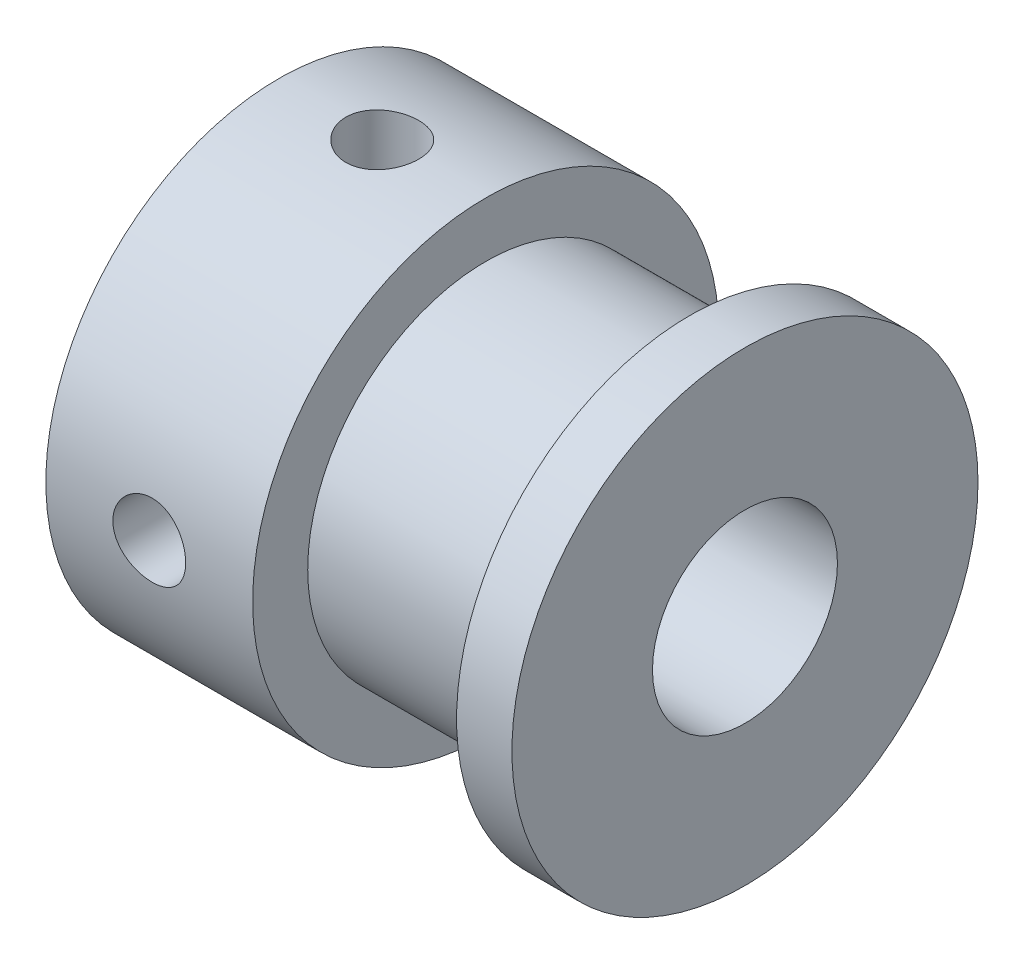
ISO-10303-21;
HEADER;
FILE_DESCRIPTION(('STEP AP214'),'2;1');
FILE_NAME('part.step','',(''),(''),'','','');
FILE_SCHEMA(('AUTOMOTIVE_DESIGN { 1 0 10303 214 1 1 1 1 }'));
ENDSEC;
DATA;
#1=APPLICATION_CONTEXT('core data for automotive mechanical design processes');
#2=APPLICATION_PROTOCOL_DEFINITION('international standard','automotive_design',2000,#1);
#3=PRODUCT_CONTEXT('',#1,'mechanical');
#4=PRODUCT('Part','Part','',(#3));
#5=PRODUCT_RELATED_PRODUCT_CATEGORY('part','',(#4));
#6=PRODUCT_DEFINITION_FORMATION('','',#4);
#7=PRODUCT_DEFINITION_CONTEXT('part definition',#1,'design');
#8=PRODUCT_DEFINITION('design','',#6,#7);
#9=PRODUCT_DEFINITION_SHAPE('','',#8);
#10=(LENGTH_UNIT() NAMED_UNIT(*) SI_UNIT(.MILLI.,.METRE.));
#11=(NAMED_UNIT(*) PLANE_ANGLE_UNIT() SI_UNIT($,.RADIAN.));
#12=(NAMED_UNIT(*) SI_UNIT($,.STERADIAN.) SOLID_ANGLE_UNIT());
#13=UNCERTAINTY_MEASURE_WITH_UNIT(LENGTH_MEASURE(1.E-05),#10,'distance_accuracy_value','');
#14=(GEOMETRIC_REPRESENTATION_CONTEXT(3) GLOBAL_UNCERTAINTY_ASSIGNED_CONTEXT((#13)) GLOBAL_UNIT_ASSIGNED_CONTEXT((#10,
#11,#12)) REPRESENTATION_CONTEXT('',''));
#15=CARTESIAN_POINT('',(0.,0.,0.));
#16=DIRECTION('',(0.,0.,1.));
#17=DIRECTION('',(1.,0.,0.));
#18=AXIS2_PLACEMENT_3D('',#15,#16,#17);
#19=CARTESIAN_POINT('',(0.,0.,0.));
#20=DIRECTION('',(1.,0.,0.));
#21=DIRECTION('',(0.,0.,-1.));
#22=AXIS2_PLACEMENT_3D('',#19,#20,#21);
#23=CYLINDRICAL_SURFACE('',#22,3.175);
#24=CARTESIAN_POINT('',(2.30000000000001,0.,3.175));
#25=CARTESIAN_POINT('',(2.3000068627745,0.0672847316330923,3.17499501338285));
#26=CARTESIAN_POINT('',(2.30546359305505,0.1346703640608,3.17283650663751));
#27=CARTESIAN_POINT('',(2.32710352845715,0.267542369031608,3.16441250521978));
#28=CARTESIAN_POINT('',(2.34331412522152,0.333023444641002,3.15813652319774));
#29=CARTESIAN_POINT('',(2.3857829777871,0.459957962416116,3.14215557601542));
#30=CARTESIAN_POINT('',(2.41200951215206,0.521423409993961,3.1324614438269));
#31=CARTESIAN_POINT('',(2.47364090841074,0.63903164640658,3.11060223187218));
#32=CARTESIAN_POINT('',(2.5090429677438,0.695176053354679,3.09843790684371));
#33=CARTESIAN_POINT('',(2.5897376821198,0.803199302091193,3.07224897424454));
#34=CARTESIAN_POINT('',(2.63538195508738,0.854801684849635,3.05816785515032));
#35=CARTESIAN_POINT('',(2.73452307874792,0.949851027050097,3.029995134943));
#36=CARTESIAN_POINT('',(2.78802352829044,0.993294227940917,3.01590353198658));
#37=CARTESIAN_POINT('',(2.9041424024409,1.07262244667806,2.98863572549245));
#38=CARTESIAN_POINT('',(2.96705314443539,1.10810421355732,2.97552454842956));
#39=CARTESIAN_POINT('',(3.098544027874,1.16785949338492,2.95258553832485));
#40=CARTESIAN_POINT('',(3.1671215628923,1.19213812572271,2.94275620617845));
#41=CARTESIAN_POINT('',(3.30482457540723,1.22768807019404,2.92809906106053));
#42=CARTESIAN_POINT('',(3.37379138336201,1.2394876533875,2.92306908743274));
#43=CARTESIAN_POINT('',(3.51289538673181,1.25139521634013,2.91799267608066));
#44=CARTESIAN_POINT('',(3.58303201481214,1.2515087076257,2.91794388907308));
#45=CARTESIAN_POINT('',(3.71747264612622,1.24044215294952,2.92266241514435));
#46=CARTESIAN_POINT('',(3.78185243388379,1.2300187638983,2.9271070555664));
#47=CARTESIAN_POINT('',(3.90786207063953,1.19943319152663,2.93977143360488));
#48=CARTESIAN_POINT('',(3.96949145415953,1.17926936651212,2.94799180758784));
#49=CARTESIAN_POINT('',(4.08970949878321,1.12939589279822,2.9674595549287));
#50=CARTESIAN_POINT('',(4.14821240698524,1.09950293840843,2.97876432051874));
#51=CARTESIAN_POINT('',(4.25958183190654,1.03114819003906,3.00311044973729));
#52=CARTESIAN_POINT('',(4.31244626347388,0.992683242204218,3.01615245182717));
#53=CARTESIAN_POINT('',(4.41519223792226,0.90489847311778,3.04369028436772));
#54=CARTESIAN_POINT('',(4.46455620057866,0.854982538626526,3.05822195069566));
#55=CARTESIAN_POINT('',(4.55437521291327,0.747422600693477,3.08627133748347));
#56=CARTESIAN_POINT('',(4.59482859712145,0.68977715576794,3.09978886808114));
#57=CARTESIAN_POINT('',(4.66632885010501,0.566964697663757,3.12460676760529));
#58=CARTESIAN_POINT('',(4.69718676961865,0.501677729871156,3.13586122258918));
#59=CARTESIAN_POINT('',(4.74730502697112,0.366284378650628,3.15453954285868));
#60=CARTESIAN_POINT('',(4.76657106552982,0.296180383098903,3.16196529078971));
#61=CARTESIAN_POINT('',(4.79192526522841,0.15748598181363,3.17180954080983));
#62=CARTESIAN_POINT('',(4.798709348115,0.0890414587092499,3.174492125026));
#63=CARTESIAN_POINT('',(4.8009546291958,-0.0480536320474739,3.17537559014029));
#64=CARTESIAN_POINT('',(4.79641864995898,-0.116704144074904,3.17357758823769));
#65=CARTESIAN_POINT('',(4.7766688987383,-0.249146112043378,3.1658751934269));
#66=CARTESIAN_POINT('',(4.76192521803439,-0.313019327348947,3.16015168509209));
#67=CARTESIAN_POINT('',(4.72281288402532,-0.437330047990826,3.14535985768854));
#68=CARTESIAN_POINT('',(4.69844298886303,-0.497767108885045,3.1362911070673));
#69=CARTESIAN_POINT('',(4.63997777394203,-0.615550644692232,3.11535083253378));
#70=CARTESIAN_POINT('',(4.60560984846939,-0.672747743207499,3.10340262881889));
#71=CARTESIAN_POINT('',(4.52842792642724,-0.780761917259374,3.07800576012949));
#72=CARTESIAN_POINT('',(4.48561060602606,-0.831576469108153,3.06455650557748));
#73=CARTESIAN_POINT('',(4.38952965745297,-0.928791348114859,3.0365593899859));
#74=CARTESIAN_POINT('',(4.33577293586608,-0.974701227513619,3.02199629492691));
#75=CARTESIAN_POINT('',(4.22105274982168,-1.05696284943212,2.99421855171024));
#76=CARTESIAN_POINT('',(4.16008825217309,-1.09331321924023,2.98100409737911));
#77=CARTESIAN_POINT('',(4.03187774635261,-1.15559997165607,2.95742074651155));
#78=CARTESIAN_POINT('',(3.96458459593159,-1.18144907129597,2.9470759174758));
#79=CARTESIAN_POINT('',(3.8260725952737,-1.2212562072246,2.93080697789355));
#80=CARTESIAN_POINT('',(3.75485655568267,-1.23522264211379,2.92487974538276));
#81=CARTESIAN_POINT('',(3.61589405502895,-1.25007804085777,2.91855940228496));
#82=CARTESIAN_POINT('',(3.5482538653394,-1.25181430561831,2.91780781401761));
#83=CARTESIAN_POINT('',(3.41369577979596,-1.24437120429059,2.92098982763324));
#84=CARTESIAN_POINT('',(3.34677779981834,-1.23519312367105,2.92492287776943));
#85=CARTESIAN_POINT('',(3.21810207173594,-1.20686591196944,2.93671925445626));
#86=CARTESIAN_POINT('',(3.15624498467543,-1.18809939057282,2.9444313340829));
#87=CARTESIAN_POINT('',(3.03652982106708,-1.14148049607648,2.96281485611587));
#88=CARTESIAN_POINT('',(2.97867280512971,-1.1136257243581,2.97348707966731));
#89=CARTESIAN_POINT('',(2.8650674647447,-1.04781462002773,2.99733186522452));
#90=CARTESIAN_POINT('',(2.80961923756217,-1.00937948877753,3.01061106475901));
#91=CARTESIAN_POINT('',(2.70568987821778,-0.924206507043677,3.0378387527675));
#92=CARTESIAN_POINT('',(2.65721118976831,-0.877465757163236,3.05178747371865));
#93=CARTESIAN_POINT('',(2.56551587816836,-0.773553196077987,3.07982295515274));
#94=CARTESIAN_POINT('',(2.52281309958007,-0.715913819660186,3.09386447942524));
#95=CARTESIAN_POINT('',(2.44769454049986,-0.593766403796401,3.11960779538581));
#96=CARTESIAN_POINT('',(2.41528012935281,-0.529257451559142,3.13130927554577));
#97=CARTESIAN_POINT('',(2.36417540099936,-0.400855491445671,3.15020502613284));
#98=CARTESIAN_POINT('',(2.34455266817755,-0.337376283301317,3.15769788512325));
#99=CARTESIAN_POINT('',(2.31563614784328,-0.207895662632507,3.16884766902594));
#100=CARTESIAN_POINT('',(2.30631397142025,-0.141901703524203,3.17251513536217));
#101=CARTESIAN_POINT('',(2.30076135384054,-0.0504531001608372,3.17470085654944));
#102=CARTESIAN_POINT('',(2.2999974262687,-0.0252336457199433,3.17500187012012));
#103=CARTESIAN_POINT('',(2.30000000000001,0.,3.175));
#104=B_SPLINE_CURVE_WITH_KNOTS('',3,(#24,#25,#26,#27,#28,#29,#30,#31,#32,#33,#34,#35,#36,#37,
#38,#39,#40,#41,#42,#43,#44,#45,#46,#47,#48,#49,#50,#51,#52,#53,#54,#55,#56,#57,#58,#59,#60,#61,
#62,#63,#64,#65,#66,#67,#68,#69,#70,#71,#72,#73,#74,#75,#76,#77,#78,#79,#80,#81,#82,#83,#84,#85,
#86,#87,#88,#89,#90,#91,#92,#93,#94,#95,#96,#97,#98,#99,#100,#101,#102,#103),.UNSPECIFIED.,.T.,
.F.,(4,2,2,2,2,2,2,2,2,2,2,2,2,2,2,2,2,2,2,2,2,2,2,2,2,2,2,2,2,2,2,2,2,2,2,2,2,2,2,4),(0.,
0.201779437744548,0.404074820308127,0.605734757050763,0.807333171478417,1.01735976436243,
1.2274828705813,1.44660259463333,1.66562209023744,1.87494520835713,2.08416960269575,
2.27936669865592,2.47459670544107,2.67374147234743,2.87295963102294,3.08705517744558,
3.30119070642572,3.51930901537433,3.73731996902137,3.94275765182502,4.14814411546712,
4.34465147529728,4.54118419440118,4.7436789821994,4.94625358697288,5.1617892735487,
5.37735589340512,5.59467927329235,5.81184892233299,6.01381057507249,6.21574844354767,
6.41019345194811,6.60468982086286,6.81009090996546,7.01556384361702,7.2337987698656,
7.45206273023339,7.65177261299093,7.85093070050895,7.92660360165657),.UNSPECIFIED.);
#105=CARTESIAN_POINT('',(2.30000000000001,0.,3.175));
#106=VERTEX_POINT('',#105);
#107=EDGE_CURVE('E81',#106,#106,#104,.T.);
#108=ORIENTED_EDGE('',*,*,#107,.F.);
#109=EDGE_LOOP('',(#108));
#110=FACE_BOUND('',#109,.T.);
#111=CARTESIAN_POINT('',(3.55,2.91858270398493,-1.25));
#112=CARTESIAN_POINT('',(3.61705876770274,2.91858919552523,-1.24999286391997));
#113=CARTESIAN_POINT('',(3.68421776991305,2.92092645038722,-1.24457161253238));
#114=CARTESIAN_POINT('',(3.81661509708974,2.92998517442319,-1.2230858011541));
#115=CARTESIAN_POINT('',(3.88184795863823,2.93671805691524,-1.20699353198018));
#116=CARTESIAN_POINT('',(4.00825570633315,2.95367783504784,-1.16486992778129));
#117=CARTESIAN_POINT('',(4.06944461339327,2.96389181028401,-1.13887530486567));
#118=CARTESIAN_POINT('',(4.18657755098346,2.98664490940932,-1.07779173231123));
#119=CARTESIAN_POINT('',(4.24252284402701,2.99918347142755,-1.04270497949831));
#120=CARTESIAN_POINT('',(4.35071189018399,3.02595080926506,-0.962353829492942));
#121=CARTESIAN_POINT('',(4.40262881457917,3.04023283739072,-0.916666915264534));
#122=CARTESIAN_POINT('',(4.49830169841413,3.06843728874988,-0.817302314146457));
#123=CARTESIAN_POINT('',(4.5420548518516,3.08235958692784,-0.763621891133199));
#124=CARTESIAN_POINT('',(4.62176349783716,3.10891201177461,-0.647285797063011));
#125=CARTESIAN_POINT('',(4.65735944266869,3.1214729200729,-0.584366556004034));
#126=CARTESIAN_POINT('',(4.71732314068053,3.14324422109986,-0.452850465301555));
#127=CARTESIAN_POINT('',(4.74169532800116,3.15245593668199,-0.384255870461472));
#128=CARTESIAN_POINT('',(4.77736018254707,3.16611423056324,-0.246760897173901));
#129=CARTESIAN_POINT('',(4.78921442617454,3.17076466636064,-0.178026840226494));
#130=CARTESIAN_POINT('',(4.80131288966092,3.17551190440968,-0.0393983009347707));
#131=CARTESIAN_POINT('',(4.80156129942229,3.17561035000669,0.030495753514629));
#132=CARTESIAN_POINT('',(4.79075388885006,3.17136802875332,0.165409649899385));
#133=CARTESIAN_POINT('',(4.780312782763,3.16726865978232,0.230487686315578));
#134=CARTESIAN_POINT('',(4.74946532592636,3.15541444614498,0.357881536818985));
#135=CARTESIAN_POINT('',(4.72905824593685,3.14765933397851,0.420197148407343));
#136=CARTESIAN_POINT('',(4.67860558354179,3.12910832817149,0.541410179653868));
#137=CARTESIAN_POINT('',(4.64842031728481,3.11826866169305,0.600242482304684));
#138=CARTESIAN_POINT('',(4.57939703639771,3.09462975143761,0.712157346885297));
#139=CARTESIAN_POINT('',(4.5405560971742,3.08182984578998,0.765237956392509));
#140=CARTESIAN_POINT('',(4.45243182003348,3.05461022779038,0.867739124124567));
#141=CARTESIAN_POINT('',(4.40264013608172,3.04013927358102,0.916709689716654));
#142=CARTESIAN_POINT('',(4.29548656480707,3.01184461230875,1.00578635680649));
#143=CARTESIAN_POINT('',(4.23812236311636,2.99802110488019,1.04588973818711));
#144=CARTESIAN_POINT('',(4.11550154425415,2.9722444532213,1.11707822475766));
#145=CARTESIAN_POINT('',(4.0500754582507,2.96035090580402,1.14789479354929));
#146=CARTESIAN_POINT('',(3.9143696785953,2.94047661183176,1.19789603572418));
#147=CARTESIAN_POINT('',(3.84409305117512,2.93249341875955,1.21708798384633));
#148=CARTESIAN_POINT('',(3.70516034266536,2.92193314346724,1.24221885837745));
#149=CARTESIAN_POINT('',(3.6366574611002,2.9190621155793,1.24887973581001));
#150=CARTESIAN_POINT('',(3.49946758767574,2.91821507641654,1.25085924710212));
#151=CARTESIAN_POINT('',(3.43078065469026,2.92023765193577,1.24618115550066));
#152=CARTESIAN_POINT('',(3.29910081239854,2.92864903711891,1.22627220656949));
#153=CARTESIAN_POINT('',(3.23600149325998,2.93479414330475,1.21162973372095));
#154=CARTESIAN_POINT('',(3.11319369775327,2.95045928061593,1.17296502005911));
#155=CARTESIAN_POINT('',(3.05348596177989,2.95998004539956,1.14894074010909));
#156=CARTESIAN_POINT('',(2.93650689226705,2.98178824537218,1.09112415058302));
#157=CARTESIAN_POINT('',(2.87942723563771,2.99417074871089,1.05698098829747));
#158=CARTESIAN_POINT('',(2.77155358654007,3.02015852173764,0.980258179031947));
#159=CARTESIAN_POINT('',(2.72076210314278,3.03376427580628,0.937675181950988));
#160=CARTESIAN_POINT('',(2.62315311375844,3.06183438952279,0.841703377564379));
#161=CARTESIAN_POINT('',(2.57687527629868,3.07629098175068,0.787761391689885));
#162=CARTESIAN_POINT('',(2.49394958907587,3.1035190255834,0.672529083864433));
#163=CARTESIAN_POINT('',(2.45730202921282,3.1162904264532,0.611238540780898));
#164=CARTESIAN_POINT('',(2.39484313276734,3.13873566281396,0.482904338615099));
#165=CARTESIAN_POINT('',(2.36901930828487,3.14841306493411,0.415867417631866));
#166=CARTESIAN_POINT('',(2.32917965457089,3.16357142711523,0.277927786036163));
#167=CARTESIAN_POINT('',(2.31515764017672,3.16905458518296,0.207027121129187));
#168=CARTESIAN_POINT('',(2.30003726977397,3.17497850608976,0.0682260342168546));
#169=CARTESIAN_POINT('',(2.29817498964644,3.17571727826717,0.000420884757595989));
#170=CARTESIAN_POINT('',(2.30542306137319,3.1728670277863,-0.13450037463068));
#171=CARTESIAN_POINT('',(2.3145318409792,3.16927862524971,-0.201616581901097));
#172=CARTESIAN_POINT('',(2.34291936225415,3.15832315585951,-0.331261459507753));
#173=CARTESIAN_POINT('',(2.36189513645233,3.15106882901496,-0.393866748155006));
#174=CARTESIAN_POINT('',(2.40916415022582,3.13355246801338,-0.51499801336059));
#175=CARTESIAN_POINT('',(2.43745913359075,3.12328987099511,-0.573523223978585));
#176=CARTESIAN_POINT('',(2.50396081746341,3.10021124636329,-0.687642991756167));
#177=CARTESIAN_POINT('',(2.54254680575914,3.08730319204293,-0.742997519181306));
#178=CARTESIAN_POINT('',(2.62796048608835,3.0604965861267,-0.846674739986252));
#179=CARTESIAN_POINT('',(2.67479143506869,3.04659764440369,-0.894994640697079));
#180=CARTESIAN_POINT('',(2.7786645370051,3.01835076024438,-0.986204093974814));
#181=CARTESIAN_POINT('',(2.83614870477354,3.00402537078839,-1.02859889387657));
#182=CARTESIAN_POINT('',(2.95787929604743,2.97745127531598,-1.10316965268165));
#183=CARTESIAN_POINT('',(3.02212660256846,2.96520284101944,-1.13534427499941));
#184=CARTESIAN_POINT('',(3.14980593068555,2.94527735121899,-1.18601952811124));
#185=CARTESIAN_POINT('',(3.21281216952646,2.93729286701932,-1.20547430735444));
#186=CARTESIAN_POINT('',(3.34135798876503,2.92533709276108,-1.23421212719399));
#187=CARTESIAN_POINT('',(3.40688989438575,2.92135450819833,-1.24352380081826));
#188=CARTESIAN_POINT('',(3.49843968257498,2.91892238480656,-1.24920484852849));
#189=CARTESIAN_POINT('',(3.52421242994351,2.91858020765141,-1.25000274419244));
#190=CARTESIAN_POINT('',(3.55,2.91858270398493,-1.25));
#191=B_SPLINE_CURVE_WITH_KNOTS('',3,(#111,#112,#113,#114,#115,#116,#117,#118,#119,#120,#121,
#122,#123,#124,#125,#126,#127,#128,#129,#130,#131,#132,#133,#134,#135,#136,#137,#138,#139,#140,
#141,#142,#143,#144,#145,#146,#147,#148,#149,#150,#151,#152,#153,#154,#155,#156,#157,#158,#159,
#160,#161,#162,#163,#164,#165,#166,#167,#168,#169,#170,#171,#172,#173,#174,#175,#176,#177,#178,
#179,#180,#181,#182,#183,#184,#185,#186,#187,#188,#189,#190),.UNSPECIFIED.,.T.,.F.,(4,2,2,2,2,2,
2,2,2,2,2,2,2,2,2,2,2,2,2,2,2,2,2,2,2,2,2,2,2,2,2,2,2,2,2,2,2,2,2,4),(0.,0.20109806062216,
0.402720363484106,0.603602331741175,0.804435808400704,1.01535170829682,1.22633996993093,
1.44534686764129,1.66426716849029,1.87288447318198,2.08142646291369,2.27861453584364,
2.47581703977309,2.67597098178837,2.87619265497002,3.08919652800103,3.30226565219754,
3.52100766319138,3.73961264265535,3.94518390476032,4.1506958077731,4.34501913391243,
4.5393847197749,4.74148953365142,4.94367473209367,5.16024174600764,5.37681527848653,
5.59313824650931,5.80934777198827,6.01183163883026,6.21428649142563,6.41086299855999,
6.60747630956881,6.81268639074811,7.01797771720266,7.23549456942807,7.45303985660975,
7.65144122721412,7.84928106635439,7.92661368823473),.UNSPECIFIED.);
#192=CARTESIAN_POINT('',(3.55,2.91858270398493,-1.25));
#193=VERTEX_POINT('',#192);
#194=EDGE_CURVE('E73',#193,#193,#191,.T.);
#195=ORIENTED_EDGE('',*,*,#194,.F.);
#196=EDGE_LOOP('',(#195));
#197=FACE_BOUND('',#196,.T.);
#198=CARTESIAN_POINT('',(16.,0.,0.));
#199=DIRECTION('',(1.,0.,0.));
#200=DIRECTION('',(0.,0.,-1.));
#201=AXIS2_PLACEMENT_3D('',#198,#199,#200);
#202=CIRCLE('',#201,3.175);
#203=CARTESIAN_POINT('',(16.,0.,-3.175));
#204=VERTEX_POINT('',#203);
#205=EDGE_CURVE('E80',#204,#204,#202,.T.);
#206=ORIENTED_EDGE('',*,*,#205,.T.);
#207=EDGE_LOOP('',(#206));
#208=FACE_BOUND('',#207,.T.);
#209=CARTESIAN_POINT('',(0.,0.,0.));
#210=DIRECTION('',(1.,0.,0.));
#211=DIRECTION('',(0.,0.,-1.));
#212=AXIS2_PLACEMENT_3D('',#209,#210,#211);
#213=CIRCLE('',#212,3.175);
#214=CARTESIAN_POINT('',(0.,0.,-3.175));
#215=VERTEX_POINT('',#214);
#216=EDGE_CURVE('E48',#215,#215,#213,.T.);
#217=ORIENTED_EDGE('',*,*,#216,.F.);
#218=EDGE_LOOP('',(#217));
#219=FACE_BOUND('',#218,.T.);
#220=ADVANCED_FACE('F32',(#110,#197,#208,#219),#23,.F.);
#221=CARTESIAN_POINT('',(0.,3.175,0.));
#222=DIRECTION('',(-1.,0.,0.));
#223=DIRECTION('',(0.,0.,1.));
#224=AXIS2_PLACEMENT_3D('',#221,#222,#223);
#225=PLANE('',#224);
#226=ORIENTED_EDGE('',*,*,#216,.T.);
#227=EDGE_LOOP('',(#226));
#228=FACE_BOUND('',#227,.T.);
#229=CARTESIAN_POINT('',(0.,0.,0.));
#230=DIRECTION('',(1.,0.,0.));
#231=DIRECTION('',(0.,0.,-1.));
#232=AXIS2_PLACEMENT_3D('',#229,#230,#231);
#233=CIRCLE('',#232,8.);
#234=CARTESIAN_POINT('',(0.,0.,-8.));
#235=VERTEX_POINT('',#234);
#236=EDGE_CURVE('E52',#235,#235,#233,.T.);
#237=ORIENTED_EDGE('',*,*,#236,.F.);
#238=EDGE_LOOP('',(#237));
#239=FACE_BOUND('',#238,.T.);
#240=ADVANCED_FACE('F106',(#228,#239),#225,.T.);
#241=CARTESIAN_POINT('',(0.,0.,0.));
#242=DIRECTION('',(1.,0.,0.));
#243=DIRECTION('',(0.,0.,-1.));
#244=AXIS2_PLACEMENT_3D('',#241,#242,#243);
#245=CYLINDRICAL_SURFACE('',#244,8.);
#246=CARTESIAN_POINT('',(2.30000000000001,0.,8.));
#247=CARTESIAN_POINT('',(2.30000284913577,-0.069757548635516,7.99999885097242));
#248=CARTESIAN_POINT('',(2.30585905688679,-0.139554702432851,7.9990780624287));
#249=CARTESIAN_POINT('',(2.32912184563838,-0.277195657489049,7.99549349048796));
#250=CARTESIAN_POINT('',(2.34653944625176,-0.345037530661656,7.99282804422361));
#251=CARTESIAN_POINT('',(2.39238983140332,-0.476756269023699,7.98605348582888));
#252=CARTESIAN_POINT('',(2.42081404068081,-0.540636176144948,7.98194549781586));
#253=CARTESIAN_POINT('',(2.48784927257081,-0.662710625522295,7.97273897019077));
#254=CARTESIAN_POINT('',(2.52645897151798,-0.720905905184149,7.96764055931276));
#255=CARTESIAN_POINT('',(2.61311652417698,-0.830459955825803,7.95697134207178));
#256=CARTESIAN_POINT('',(2.66123349744513,-0.881763739571317,7.95139725696168));
#257=CARTESIAN_POINT('',(2.76539097413445,-0.97560384411411,7.94043038065143));
#258=CARTESIAN_POINT('',(2.8214319486501,-1.01813964327095,7.93503760025374));
#259=CARTESIAN_POINT('',(2.94021913567187,-1.09345272164441,7.92501214063723));
#260=CARTESIAN_POINT('',(3.0029997411809,-1.12617636778995,7.92038369893052));
#261=CARTESIAN_POINT('',(3.1332507054289,-1.18059340798532,7.91245600871183));
#262=CARTESIAN_POINT('',(3.20072078625528,-1.20228745505031,7.90915668151108));
#263=CARTESIAN_POINT('',(3.33785545057189,-1.23385779661083,7.90429317255518));
#264=CARTESIAN_POINT('',(3.4074977929094,-1.24382852743747,7.90271513266182));
#265=CARTESIAN_POINT('',(3.54748359444632,-1.2519618487881,7.90143085535887));
#266=CARTESIAN_POINT('',(3.61782700973302,-1.25012517430232,7.90172450144011));
#267=CARTESIAN_POINT('',(3.75654851592634,-1.23477290404444,7.90413775227603));
#268=CARTESIAN_POINT('',(3.82493861167657,-1.22136281479846,7.90624086092473));
#269=CARTESIAN_POINT('',(3.95848600317966,-1.18340968916875,7.91201028172737));
#270=CARTESIAN_POINT('',(4.02364320032027,-1.15886631342065,7.91567664153206));
#271=CARTESIAN_POINT('',(4.14919435633857,-1.09923458474692,7.92417753427311));
#272=CARTESIAN_POINT('',(4.20956689588653,-1.06410186157774,7.92901696543622));
#273=CARTESIAN_POINT('',(4.32359976784276,-0.98432029073318,7.93931523075049));
#274=CARTESIAN_POINT('',(4.37725962244373,-0.939670766265077,7.94477410894106));
#275=CARTESIAN_POINT('',(4.47695512331665,-0.841545444111659,7.95576893124448));
#276=CARTESIAN_POINT('',(4.52290157913472,-0.787979002802691,7.96130506817796));
#277=CARTESIAN_POINT('',(4.60516657281994,-0.673848473689676,7.97177562673913));
#278=CARTESIAN_POINT('',(4.64148506177841,-0.613284350340655,7.97671004531012));
#279=CARTESIAN_POINT('',(4.70346903671119,-0.486797963528243,7.98542699513518));
#280=CARTESIAN_POINT('',(4.72912727926649,-0.420872093120228,7.98920874270967));
#281=CARTESIAN_POINT('',(4.76898298372361,-0.285574767348378,7.99518780000339));
#282=CARTESIAN_POINT('',(4.78318128703323,-0.216203565343599,7.99738522604488));
#283=CARTESIAN_POINT('',(4.79959463822509,-0.0767541683818671,7.99993255863639));
#284=CARTESIAN_POINT('',(4.80193223948808,-0.00669073075435092,8.0003013589643));
#285=CARTESIAN_POINT('',(4.794883647332,0.13282727320582,7.99920143245634));
#286=CARTESIAN_POINT('',(4.78549784870544,0.202281859962577,7.99773276749821));
#287=CARTESIAN_POINT('',(4.7553708061599,0.33823672313285,7.99313461846611));
#288=CARTESIAN_POINT('',(4.73468962086613,0.404750631028018,7.99001392107693));
#289=CARTESIAN_POINT('',(4.6826224528006,0.533367033928309,7.98246037841779));
#290=CARTESIAN_POINT('',(4.65123593077866,0.5954693065197,7.97802746705036));
#291=CARTESIAN_POINT('',(4.5783640044367,0.714036101125199,7.96829486370472));
#292=CARTESIAN_POINT('',(4.53680128995476,0.770452561891857,7.9629886433171));
#293=CARTESIAN_POINT('',(4.4448639570461,0.875553482539024,7.95211940232218));
#294=CARTESIAN_POINT('',(4.39448878039757,0.924237452235083,7.94655636546338));
#295=CARTESIAN_POINT('',(4.28580940139139,1.01294040388345,7.93574013768325));
#296=CARTESIAN_POINT('',(4.22743757643883,1.05287699292062,7.93049020595401));
#297=CARTESIAN_POINT('',(4.10474196316933,1.12237783863319,7.92095346402914));
#298=CARTESIAN_POINT('',(4.04041834625526,1.15194239389052,7.91666662610999));
#299=CARTESIAN_POINT('',(3.9078851796429,1.19973385972497,7.90956535676178));
#300=CARTESIAN_POINT('',(3.83969126561719,1.21800327473955,7.9067454117448));
#301=CARTESIAN_POINT('',(3.70115542816801,1.24282061020267,7.90288285140397));
#302=CARTESIAN_POINT('',(3.6308136672905,1.24936941542498,7.9018401019222));
#303=CARTESIAN_POINT('',(3.49080064204626,1.25053726345377,7.90165529022442));
#304=CARTESIAN_POINT('',(3.42113045153325,1.24528590274212,7.90249258021451));
#305=CARTESIAN_POINT('',(3.28367735142786,1.2232811162795,7.90592849470915));
#306=CARTESIAN_POINT('',(3.21589443774914,1.2065277154348,7.90852711539976));
#307=CARTESIAN_POINT('',(3.08418108667974,1.16204164945925,7.91518544427453));
#308=CARTESIAN_POINT('',(3.0202472608708,1.1343188086929,7.91924384476704));
#309=CARTESIAN_POINT('',(2.89791719316187,1.06869384273208,7.92836592023698));
#310=CARTESIAN_POINT('',(2.83952117085579,1.03079131410442,7.93342963505413));
#311=CARTESIAN_POINT('',(2.72926722793659,0.945415040695391,7.9440578404613));
#312=CARTESIAN_POINT('',(2.67748390169309,0.897845535473835,7.94962700580145));
#313=CARTESIAN_POINT('',(2.58258938180664,0.794687973191014,7.96060021820367));
#314=CARTESIAN_POINT('',(2.53948020070407,0.739098060392156,7.96600422670061));
#315=CARTESIAN_POINT('',(2.46292438848422,0.621083429421702,7.9760755122835));
#316=CARTESIAN_POINT('',(2.4295373136202,0.558619686071186,7.98073817215134));
#317=CARTESIAN_POINT('',(2.37377950190353,0.428925941178889,7.9887562991944));
#318=CARTESIAN_POINT('',(2.35139751372081,0.361700888290878,7.9921131007106));
#319=CARTESIAN_POINT('',(2.32328348945471,0.245157119955795,7.9963872293244));
#320=CARTESIAN_POINT('',(2.31456575468551,0.196552787825811,7.99773495813061));
#321=CARTESIAN_POINT('',(2.30292304331047,0.0986388989252902,7.99954174348811));
#322=CARTESIAN_POINT('',(2.29999798522134,0.0493293520845589,8.00000081253982));
#323=CARTESIAN_POINT('',(2.30000000000001,0.,8.));
#324=B_SPLINE_CURVE_WITH_KNOTS('',3,(#246,#247,#248,#249,#250,#251,#252,#253,#254,#255,#256,
#257,#258,#259,#260,#261,#262,#263,#264,#265,#266,#267,#268,#269,#270,#271,#272,#273,#274,#275,
#276,#277,#278,#279,#280,#281,#282,#283,#284,#285,#286,#287,#288,#289,#290,#291,#292,#293,#294,
#295,#296,#297,#298,#299,#300,#301,#302,#303,#304,#305,#306,#307,#308,#309,#310,#311,#312,#313,
#314,#315,#316,#317,#318,#319,#320,#321,#322,#323),.UNSPECIFIED.,.T.,.F.,(4,2,2,2,2,2,2,2,2,2,2,
2,2,2,2,2,2,2,2,2,2,2,2,2,2,2,2,2,2,2,2,2,2,2,2,2,2,2,4),(0.,0.209092370238744,
0.418384321264004,0.62751353972051,0.836615593960144,1.04729784076099,1.2579926182271,
1.46981889302879,1.68163262504618,1.89172815567496,2.10181060835271,2.30999788011288,
2.51819149825524,2.72726988701172,2.93636314946032,3.14772866167181,3.35909524756911,
3.5706052187728,3.78209965914931,3.99140427002955,4.20070183264175,4.4088972237828,
4.61710310371012,4.82694270734832,5.03679560800705,5.24854740124792,5.46029309824487,
5.67123705197562,5.88216508114644,6.09078790799342,6.29941028309444,6.50784623483305,
6.7162904483567,6.92691006157766,7.13757848571145,7.34951152099917,7.56122742828135,
7.70909008175765,7.85695065529349),.UNSPECIFIED.);
#325=CARTESIAN_POINT('',(2.30000000000001,0.,8.));
#326=VERTEX_POINT('',#325);
#327=EDGE_CURVE('E10',#326,#326,#324,.T.);
#328=ORIENTED_EDGE('',*,*,#327,.F.);
#329=EDGE_LOOP('',(#328));
#330=FACE_BOUND('',#329,.T.);
#331=CARTESIAN_POINT('',(4.8,8.,0.));
#332=CARTESIAN_POINT('',(4.79999715086424,7.99999885097242,-0.0697575486355163));
#333=CARTESIAN_POINT('',(4.79414094311322,7.9990780624287,-0.139554702432852));
#334=CARTESIAN_POINT('',(4.77087815436162,7.99549349048796,-0.27719565748905));
#335=CARTESIAN_POINT('',(4.75346055374824,7.99282804422361,-0.345037530661658));
#336=CARTESIAN_POINT('',(4.70761016859669,7.98605348582888,-0.476756269023701));
#337=CARTESIAN_POINT('',(4.6791859593192,7.98194549781586,-0.54063617614495));
#338=CARTESIAN_POINT('',(4.61215072742919,7.97273897019077,-0.662710625522298));
#339=CARTESIAN_POINT('',(4.57354102848203,7.96764055931276,-0.720905905184153));
#340=CARTESIAN_POINT('',(4.48688347582302,7.95697134207178,-0.830459955825808));
#341=CARTESIAN_POINT('',(4.43876650255487,7.95139725696168,-0.881763739571321));
#342=CARTESIAN_POINT('',(4.33460902586555,7.94043038065143,-0.975603844114115));
#343=CARTESIAN_POINT('',(4.2785680513499,7.93503760025374,-1.01813964327096));
#344=CARTESIAN_POINT('',(4.15978086432814,7.92501214063723,-1.09345272164442));
#345=CARTESIAN_POINT('',(4.0970002588191,7.92038369893052,-1.12617636778996));
#346=CARTESIAN_POINT('',(3.9667492945711,7.91245600871182,-1.18059340798532));
#347=CARTESIAN_POINT('',(3.89927921374472,7.90915668151108,-1.20228745505032));
#348=CARTESIAN_POINT('',(3.76214454942811,7.90429317255518,-1.23385779661083));
#349=CARTESIAN_POINT('',(3.6925022070906,7.90271513266182,-1.24382852743748));
#350=CARTESIAN_POINT('',(3.55251640555368,7.90143085535887,-1.25196184878811));
#351=CARTESIAN_POINT('',(3.48217299026698,7.90172450144011,-1.25012517430233));
#352=CARTESIAN_POINT('',(3.34345148407366,7.90413775227603,-1.23477290404445));
#353=CARTESIAN_POINT('',(3.27506138832343,7.90624086092473,-1.22136281479846));
#354=CARTESIAN_POINT('',(3.14151399682034,7.91201028172736,-1.18340968916876));
#355=CARTESIAN_POINT('',(3.07635679967973,7.91567664153206,-1.15886631342066));
#356=CARTESIAN_POINT('',(2.95080564366142,7.92417753427311,-1.09923458474692));
#357=CARTESIAN_POINT('',(2.89043310411347,7.92901696543622,-1.06410186157774));
#358=CARTESIAN_POINT('',(2.77640023215723,7.93931523075049,-0.984320290733184));
#359=CARTESIAN_POINT('',(2.72274037755627,7.94477410894106,-0.939670766265081));
#360=CARTESIAN_POINT('',(2.62304487668334,7.95576893124448,-0.841545444111663));
#361=CARTESIAN_POINT('',(2.57709842086527,7.96130506817796,-0.787979002802694));
#362=CARTESIAN_POINT('',(2.49483342718005,7.97177562673913,-0.673848473689679));
#363=CARTESIAN_POINT('',(2.45851493822159,7.97671004531012,-0.613284350340658));
#364=CARTESIAN_POINT('',(2.3965309632888,7.98542699513518,-0.486797963528245));
#365=CARTESIAN_POINT('',(2.3708727207335,7.98920874270967,-0.42087209312023));
#366=CARTESIAN_POINT('',(2.33101701627639,7.99518780000339,-0.285574767348379));
#367=CARTESIAN_POINT('',(2.31681871296676,7.99738522604488,-0.2162035653436));
#368=CARTESIAN_POINT('',(2.30040536177491,7.99993255863639,-0.0767541683818674));
#369=CARTESIAN_POINT('',(2.29806776051191,8.0003013589643,-0.00669073075435069));
#370=CARTESIAN_POINT('',(2.30511635266799,7.99920143245634,0.132827273205821));
#371=CARTESIAN_POINT('',(2.31450215129456,7.99773276749821,0.202281859962578));
#372=CARTESIAN_POINT('',(2.34462919384009,7.99313461846611,0.338236723132852));
#373=CARTESIAN_POINT('',(2.36531037913387,7.99001392107693,0.40475063102802));
#374=CARTESIAN_POINT('',(2.4173775471994,7.98246037841779,0.533367033928312));
#375=CARTESIAN_POINT('',(2.44876406922134,7.97802746705036,0.595469306519703));
#376=CARTESIAN_POINT('',(2.52163599556329,7.96829486370472,0.714036101125203));
#377=CARTESIAN_POINT('',(2.56319871004524,7.9629886433171,0.770452561891861));
#378=CARTESIAN_POINT('',(2.65513604295389,7.95211940232218,0.875553482539029));
#379=CARTESIAN_POINT('',(2.70551121960243,7.94655636546338,0.924237452235088));
#380=CARTESIAN_POINT('',(2.81419059860861,7.93574013768325,1.01294040388345));
#381=CARTESIAN_POINT('',(2.87256242356117,7.93049020595401,1.05287699292063));
#382=CARTESIAN_POINT('',(2.99525803683067,7.92095346402914,1.1223778386332));
#383=CARTESIAN_POINT('',(3.05958165374474,7.91666662610998,1.15194239389052));
#384=CARTESIAN_POINT('',(3.1921148203571,7.90956535676178,1.19973385972497));
#385=CARTESIAN_POINT('',(3.26030873438281,7.9067454117448,1.21800327473956));
#386=CARTESIAN_POINT('',(3.39884457183199,7.90288285140397,1.24282061020268));
#387=CARTESIAN_POINT('',(3.4691863327095,7.9018401019222,1.24936941542498));
#388=CARTESIAN_POINT('',(3.60919935795374,7.90165529022442,1.25053726345378));
#389=CARTESIAN_POINT('',(3.67886954846675,7.90249258021451,1.24528590274212));
#390=CARTESIAN_POINT('',(3.81632264857214,7.90592849470915,1.2232811162795));
#391=CARTESIAN_POINT('',(3.88410556225086,7.90852711539975,1.2065277154348));
#392=CARTESIAN_POINT('',(4.01581891332026,7.91518544427453,1.16204164945926));
#393=CARTESIAN_POINT('',(4.0797527391292,7.91924384476704,1.1343188086929));
#394=CARTESIAN_POINT('',(4.20208280683813,7.92836592023698,1.06869384273208));
#395=CARTESIAN_POINT('',(4.26047882914421,7.93342963505413,1.03079131410443));
#396=CARTESIAN_POINT('',(4.37073277206341,7.9440578404613,0.945415040695397));
#397=CARTESIAN_POINT('',(4.42251609830692,7.94962700580145,0.897845535473841));
#398=CARTESIAN_POINT('',(4.51741061819337,7.96060021820367,0.794687973191019));
#399=CARTESIAN_POINT('',(4.56051979929594,7.96600422670061,0.739098060392161));
#400=CARTESIAN_POINT('',(4.63707561151578,7.9760755122835,0.621083429421706));
#401=CARTESIAN_POINT('',(4.67046268637981,7.98073817215134,0.55861968607119));
#402=CARTESIAN_POINT('',(4.72622049809647,7.9887562991944,0.428925941178891));
#403=CARTESIAN_POINT('',(4.74860248627919,7.9921131007106,0.36170088829088));
#404=CARTESIAN_POINT('',(4.77671651054529,7.9963872293244,0.245157119955796));
#405=CARTESIAN_POINT('',(4.7854342453145,7.99773495813061,0.196552787825812));
#406=CARTESIAN_POINT('',(4.79707695668954,7.99954174348811,0.0986388989252907));
#407=CARTESIAN_POINT('',(4.80000201477867,8.00000081253982,0.0493293520845591));
#408=CARTESIAN_POINT('',(4.8,8.,0.));
#409=B_SPLINE_CURVE_WITH_KNOTS('',3,(#331,#332,#333,#334,#335,#336,#337,#338,#339,#340,#341,
#342,#343,#344,#345,#346,#347,#348,#349,#350,#351,#352,#353,#354,#355,#356,#357,#358,#359,#360,
#361,#362,#363,#364,#365,#366,#367,#368,#369,#370,#371,#372,#373,#374,#375,#376,#377,#378,#379,
#380,#381,#382,#383,#384,#385,#386,#387,#388,#389,#390,#391,#392,#393,#394,#395,#396,#397,#398,
#399,#400,#401,#402,#403,#404,#405,#406,#407,#408),.UNSPECIFIED.,.T.,.F.,(4,2,2,2,2,2,2,2,2,2,2,
2,2,2,2,2,2,2,2,2,2,2,2,2,2,2,2,2,2,2,2,2,2,2,2,2,2,2,4),(0.,0.209092370238745,
0.418384321264006,0.627513539720513,0.836615593960148,1.04729784076099,1.25799261822711,
1.46981889302879,1.68163262504619,1.89172815567497,2.10181060835272,2.3099978801129,
2.51819149825525,2.72726988701173,2.93636314946034,3.14772866167183,3.35909524756913,
3.57060521877282,3.78209965914932,3.99140427002957,4.20070183264178,4.40889722378283,
4.61710310371015,4.82694270734835,5.03679560800707,5.24854740124795,5.4602930982449,
5.67123705197565,5.88216508114647,6.09078790799345,6.29941028309447,6.50784623483308,
6.71629044835673,6.9269100615777,7.13757848571149,7.3495115209992,7.56122742828139,
7.70909008175769,7.85695065529353),.UNSPECIFIED.);
#410=CARTESIAN_POINT('',(4.8,8.,0.));
#411=VERTEX_POINT('',#410);
#412=EDGE_CURVE('E44',#411,#411,#409,.T.);
#413=ORIENTED_EDGE('',*,*,#412,.F.);
#414=EDGE_LOOP('',(#413));
#415=FACE_BOUND('',#414,.T.);
#416=ORIENTED_EDGE('',*,*,#236,.T.);
#417=EDGE_LOOP('',(#416));
#418=FACE_BOUND('',#417,.T.);
#419=CARTESIAN_POINT('',(7.1,0.,0.));
#420=DIRECTION('',(1.,0.,0.));
#421=DIRECTION('',(0.,0.,-1.));
#422=AXIS2_PLACEMENT_3D('',#419,#420,#421);
#423=CIRCLE('',#422,8.);
#424=CARTESIAN_POINT('',(7.1,0.,-8.));
#425=VERTEX_POINT('',#424);
#426=EDGE_CURVE('E99',#425,#425,#423,.T.);
#427=ORIENTED_EDGE('',*,*,#426,.F.);
#428=EDGE_LOOP('',(#427));
#429=FACE_BOUND('',#428,.T.);
#430=ADVANCED_FACE('F59',(#330,#415,#418,#429),#245,.T.);
#431=CARTESIAN_POINT('',(7.1,8.,0.));
#432=DIRECTION('',(1.,0.,0.));
#433=DIRECTION('',(0.,0.,-1.));
#434=AXIS2_PLACEMENT_3D('',#431,#432,#433);
#435=PLANE('',#434);
#436=ORIENTED_EDGE('',*,*,#426,.T.);
#437=EDGE_LOOP('',(#436));
#438=FACE_BOUND('',#437,.T.);
#439=CARTESIAN_POINT('',(7.1,0.,0.));
#440=DIRECTION('',(1.,0.,0.));
#441=DIRECTION('',(0.,0.,-1.));
#442=AXIS2_PLACEMENT_3D('',#439,#440,#441);
#443=CIRCLE('',#442,6.11);
#444=CARTESIAN_POINT('',(7.1,0.,-6.11));
#445=VERTEX_POINT('',#444);
#446=EDGE_CURVE('E96',#445,#445,#443,.T.);
#447=ORIENTED_EDGE('',*,*,#446,.F.);
#448=EDGE_LOOP('',(#447));
#449=FACE_BOUND('',#448,.T.);
#450=ADVANCED_FACE('F113',(#438,#449),#435,.T.);
#451=CARTESIAN_POINT('',(0.,0.,0.));
#452=DIRECTION('',(1.,0.,0.));
#453=DIRECTION('',(0.,0.,-1.));
#454=AXIS2_PLACEMENT_3D('',#451,#452,#453);
#455=CYLINDRICAL_SURFACE('',#454,6.11);
#456=ORIENTED_EDGE('',*,*,#446,.T.);
#457=EDGE_LOOP('',(#456));
#458=FACE_BOUND('',#457,.T.);
#459=CARTESIAN_POINT('',(14.1,0.,0.));
#460=DIRECTION('',(1.,0.,0.));
#461=DIRECTION('',(0.,0.,-1.));
#462=AXIS2_PLACEMENT_3D('',#459,#460,#461);
#463=CIRCLE('',#462,6.11);
#464=CARTESIAN_POINT('',(14.1,0.,-6.11));
#465=VERTEX_POINT('',#464);
#466=EDGE_CURVE('E93',#465,#465,#463,.T.);
#467=ORIENTED_EDGE('',*,*,#466,.F.);
#468=EDGE_LOOP('',(#467));
#469=FACE_BOUND('',#468,.T.);
#470=ADVANCED_FACE('F140',(#458,#469),#455,.T.);
#471=CARTESIAN_POINT('',(14.1,6.11,0.));
#472=DIRECTION('',(-1.,0.,0.));
#473=DIRECTION('',(0.,0.,1.));
#474=AXIS2_PLACEMENT_3D('',#471,#472,#473);
#475=PLANE('',#474);
#476=ORIENTED_EDGE('',*,*,#466,.T.);
#477=EDGE_LOOP('',(#476));
#478=FACE_BOUND('',#477,.T.);
#479=CARTESIAN_POINT('',(14.1,0.,0.));
#480=DIRECTION('',(1.,0.,0.));
#481=DIRECTION('',(0.,0.,-1.));
#482=AXIS2_PLACEMENT_3D('',#479,#480,#481);
#483=CIRCLE('',#482,8.);
#484=CARTESIAN_POINT('',(14.1,0.,-8.));
#485=VERTEX_POINT('',#484);
#486=EDGE_CURVE('E90',#485,#485,#483,.T.);
#487=ORIENTED_EDGE('',*,*,#486,.F.);
#488=EDGE_LOOP('',(#487));
#489=FACE_BOUND('',#488,.T.);
#490=ADVANCED_FACE('F133',(#478,#489),#475,.T.);
#491=CARTESIAN_POINT('',(0.,0.,0.));
#492=DIRECTION('',(1.,0.,0.));
#493=DIRECTION('',(0.,0.,-1.));
#494=AXIS2_PLACEMENT_3D('',#491,#492,#493);
#495=CYLINDRICAL_SURFACE('',#494,8.);
#496=ORIENTED_EDGE('',*,*,#486,.T.);
#497=EDGE_LOOP('',(#496));
#498=FACE_BOUND('',#497,.T.);
#499=CARTESIAN_POINT('',(16.,0.,0.));
#500=DIRECTION('',(1.,0.,0.));
#501=DIRECTION('',(0.,0.,-1.));
#502=AXIS2_PLACEMENT_3D('',#499,#500,#501);
#503=CIRCLE('',#502,8.);
#504=CARTESIAN_POINT('',(16.,0.,-8.));
#505=VERTEX_POINT('',#504);
#506=EDGE_CURVE('E87',#505,#505,#503,.T.);
#507=ORIENTED_EDGE('',*,*,#506,.F.);
#508=EDGE_LOOP('',(#507));
#509=FACE_BOUND('',#508,.T.);
#510=ADVANCED_FACE('F128',(#498,#509),#495,.T.);
#511=CARTESIAN_POINT('',(16.,8.,0.));
#512=DIRECTION('',(1.,0.,0.));
#513=DIRECTION('',(0.,0.,-1.));
#514=AXIS2_PLACEMENT_3D('',#511,#512,#513);
#515=PLANE('',#514);
#516=ORIENTED_EDGE('',*,*,#506,.T.);
#517=EDGE_LOOP('',(#516));
#518=FACE_BOUND('',#517,.T.);
#519=ORIENTED_EDGE('',*,*,#205,.F.);
#520=EDGE_LOOP('',(#519));
#521=FACE_BOUND('',#520,.T.);
#522=ADVANCED_FACE('F67',(#518,#521),#515,.T.);
#523=CARTESIAN_POINT('',(3.55,0.,0.));
#524=DIRECTION('',(0.,-1.,0.));
#525=DIRECTION('',(0.,0.,-1.));
#526=AXIS2_PLACEMENT_3D('',#523,#524,#525);
#527=CYLINDRICAL_SURFACE('',#526,1.25);
#528=ORIENTED_EDGE('',*,*,#194,.T.);
#529=EDGE_LOOP('',(#528));
#530=FACE_BOUND('',#529,.T.);
#531=ORIENTED_EDGE('',*,*,#412,.T.);
#532=EDGE_LOOP('',(#531));
#533=FACE_BOUND('',#532,.T.);
#534=ADVANCED_FACE('F62',(#530,#533),#527,.F.);
#535=CARTESIAN_POINT('',(3.55,0.,0.));
#536=DIRECTION('',(0.,0.,-1.));
#537=DIRECTION('',(-1.,0.,0.));
#538=AXIS2_PLACEMENT_3D('',#535,#536,#537);
#539=CYLINDRICAL_SURFACE('',#538,1.24999999999999);
#540=ORIENTED_EDGE('',*,*,#107,.T.);
#541=EDGE_LOOP('',(#540));
#542=FACE_BOUND('',#541,.T.);
#543=ORIENTED_EDGE('',*,*,#327,.T.);
#544=EDGE_LOOP('',(#543));
#545=FACE_BOUND('',#544,.T.);
#546=ADVANCED_FACE('F66',(#542,#545),#539,.F.);
#547=CLOSED_SHELL('',(#220,#240,#430,#450,#470,#490,#510,#522,#534,#546));
#548=MANIFOLD_SOLID_BREP('B2',#547);
#549=ADVANCED_BREP_SHAPE_REPRESENTATION('',(#18,#548),#14);
#550=SHAPE_DEFINITION_REPRESENTATION(#9,#549);
ENDSEC;
END-ISO-10303-21;
